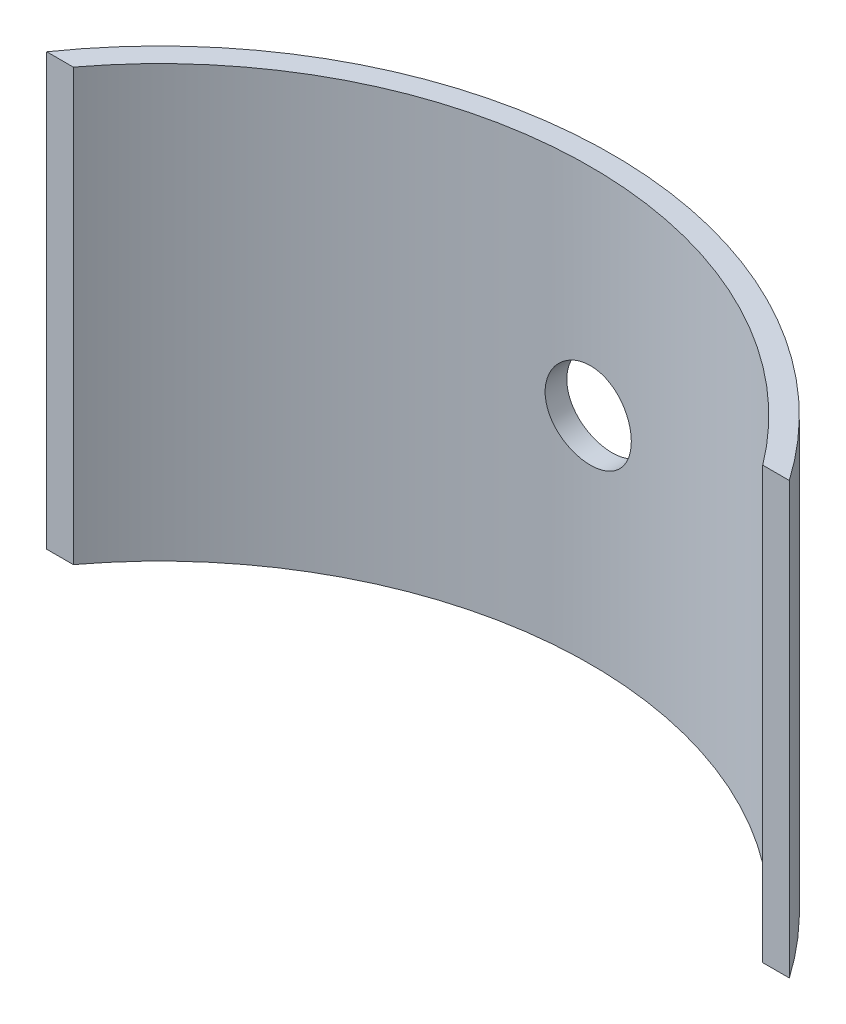
ISO-10303-21;
HEADER;
FILE_DESCRIPTION(('STEP AP214'),'2;1');
FILE_NAME('part.step','',(''),(''),'','','');
FILE_SCHEMA(('AUTOMOTIVE_DESIGN { 1 0 10303 214 1 1 1 1 }'));
ENDSEC;
DATA;
#1=APPLICATION_CONTEXT('core data for automotive mechanical design processes');
#2=APPLICATION_PROTOCOL_DEFINITION('international standard','automotive_design',2000,#1);
#3=PRODUCT_CONTEXT('',#1,'mechanical');
#4=PRODUCT('Part','Part','',(#3));
#5=PRODUCT_RELATED_PRODUCT_CATEGORY('part','',(#4));
#6=PRODUCT_DEFINITION_FORMATION('','',#4);
#7=PRODUCT_DEFINITION_CONTEXT('part definition',#1,'design');
#8=PRODUCT_DEFINITION('design','',#6,#7);
#9=PRODUCT_DEFINITION_SHAPE('','',#8);
#10=(LENGTH_UNIT() NAMED_UNIT(*) SI_UNIT(.MILLI.,.METRE.));
#11=(NAMED_UNIT(*) PLANE_ANGLE_UNIT() SI_UNIT($,.RADIAN.));
#12=(NAMED_UNIT(*) SI_UNIT($,.STERADIAN.) SOLID_ANGLE_UNIT());
#13=UNCERTAINTY_MEASURE_WITH_UNIT(LENGTH_MEASURE(1.E-05),#10,'distance_accuracy_value','');
#14=(GEOMETRIC_REPRESENTATION_CONTEXT(3) GLOBAL_UNCERTAINTY_ASSIGNED_CONTEXT((#13)) GLOBAL_UNIT_ASSIGNED_CONTEXT((#10,
#11,#12)) REPRESENTATION_CONTEXT('',''));
#15=CARTESIAN_POINT('',(0.,0.,0.));
#16=DIRECTION('',(0.,0.,1.));
#17=DIRECTION('',(1.,0.,0.));
#18=AXIS2_PLACEMENT_3D('',#15,#16,#17);
#19=CARTESIAN_POINT('',(0.,25.,0.));
#20=DIRECTION('',(0.,-1.,0.));
#21=DIRECTION('',(0.,0.,-1.));
#22=AXIS2_PLACEMENT_3D('',#19,#20,#21);
#23=CYLINDRICAL_SURFACE('',#22,52.5);
#24=CARTESIAN_POINT('',(0.,-5.,-52.5));
#25=CARTESIAN_POINT('',(0.14013531364392,-5.00000134151966,-52.5000003479525));
#26=CARTESIAN_POINT('',(0.280250015853205,-4.99410638656914,-52.4994377790158));
#27=CARTESIAN_POINT('',(0.559525517952074,-4.97057007837217,-52.4972039627474));
#28=CARTESIAN_POINT('',(0.698686078759655,-4.95292588247516,-52.4955324471138));
#29=CARTESIAN_POINT('',(0.9751257170425,-4.90599667980016,-52.4911255343365));
#30=CARTESIAN_POINT('',(1.11240318560683,-4.87670229078819,-52.4883892797665));
#31=CARTESIAN_POINT('',(1.38403908304545,-4.80667397998405,-52.4819292679164));
#32=CARTESIAN_POINT('',(1.51839642436785,-4.76593587224384,-52.4782051493177));
#33=CARTESIAN_POINT('',(1.78305864402921,-4.67336465527754,-52.4698791325933));
#34=CARTESIAN_POINT('',(1.91336730385473,-4.62154227881319,-52.4652780840543));
#35=CARTESIAN_POINT('',(2.1691966908205,-4.50713074808496,-52.4553236642844));
#36=CARTESIAN_POINT('',(2.29471563422844,-4.44453762960092,-52.4499700161892));
#37=CARTESIAN_POINT('',(2.53996215115011,-4.30908394766377,-52.4386656442903));
#38=CARTESIAN_POINT('',(2.6596930222629,-4.23622932527749,-52.4327152665432));
#39=CARTESIAN_POINT('',(2.89264660361316,-4.08071270179384,-52.4203797029591));
#40=CARTESIAN_POINT('',(3.00586688716291,-3.99804707857352,-52.4139943569091));
#41=CARTESIAN_POINT('',(3.22523963224673,-3.82328987048598,-52.4009535829521));
#42=CARTESIAN_POINT('',(3.33137336210372,-3.73117481932242,-52.3942975087111));
#43=CARTESIAN_POINT('',(3.53554907907228,-3.53830770625079,-52.3809160496089));
#44=CARTESIAN_POINT('',(3.63358806096828,-3.43755246467724,-52.3741906400398));
#45=CARTESIAN_POINT('',(3.82081058979451,-3.22817635951285,-52.3608652908138));
#46=CARTESIAN_POINT('',(3.90999698442136,-3.11955804488229,-52.3542653113647));
#47=CARTESIAN_POINT('',(4.07895213282873,-2.89514826589471,-52.3413730505385));
#48=CARTESIAN_POINT('',(4.15871739914528,-2.77935416927736,-52.3350808836077));
#49=CARTESIAN_POINT('',(4.30834224147955,-2.54125679996572,-52.3229761452991));
#50=CARTESIAN_POINT('',(4.37818622115252,-2.41894368542182,-52.3171643349131));
#51=CARTESIAN_POINT('',(4.5073440806059,-2.16879554668699,-52.3061951564515));
#52=CARTESIAN_POINT('',(4.56665405158915,-2.04095849454375,-52.301038031508));
#53=CARTESIAN_POINT('',(4.6742630971734,-1.78074927309192,-52.2915307788065));
#54=CARTESIAN_POINT('',(4.72256642893059,-1.64837888005766,-52.2871803391599));
#55=CARTESIAN_POINT('',(4.80785448461475,-1.37999976807615,-52.2794064713136));
#56=CARTESIAN_POINT('',(4.84483503943895,-1.24398972898887,-52.2759833846233));
#57=CARTESIAN_POINT('',(4.9381067857902,-0.832886001745291,-52.2672863255648));
#58=CARTESIAN_POINT('',(4.97717685129579,-0.553630164649157,-52.2635435356118));
#59=CARTESIAN_POINT('',(5.00789071078609,0.00734656142198955,-52.2606088213119));
#60=CARTESIAN_POINT('',(4.99953564269351,0.289067391089816,-52.2614167877736));
#61=CARTESIAN_POINT('',(4.93581526450042,0.846187430781424,-52.2674730104633));
#62=CARTESIAN_POINT('',(4.88060446093488,1.12160436604719,-52.2727066727795));
#63=CARTESIAN_POINT('',(4.7249636075338,1.65923401158937,-52.2870038384773));
#64=CARTESIAN_POINT('',(4.62453299807275,1.92144655840793,-52.2960673892562));
#65=CARTESIAN_POINT('',(4.38113647263762,2.42572695741525,-52.3170193503286));
#66=CARTESIAN_POINT('',(4.23810175545865,2.66776140866777,-52.3289123235442));
#67=CARTESIAN_POINT('',(3.9136055470322,3.1244461199737,-52.354179282115));
#68=CARTESIAN_POINT('',(3.73214303632053,3.33909565328103,-52.367553306757));
#69=CARTESIAN_POINT('',(3.33507831222411,3.73581661737379,-52.3943404442024));
#70=CARTESIAN_POINT('',(3.11934258447055,3.9177544493259,-52.4077534996668));
#71=CARTESIAN_POINT('',(2.66031956348734,4.24285248003091,-52.4330568057246));
#72=CARTESIAN_POINT('',(2.41703224355478,4.38601264120018,-52.4449470548419));
#73=CARTESIAN_POINT('',(1.90972127088827,4.62948534982558,-52.4658684219416));
#74=CARTESIAN_POINT('',(1.64569447167729,4.72979138077287,-52.4748991050369));
#75=CARTESIAN_POINT('',(1.10444177653763,4.88461190890257,-52.4890792429146));
#76=CARTESIAN_POINT('',(0.827216238752712,4.93912764784319,-52.4942288029462));
#77=CARTESIAN_POINT('',(0.268592776480475,5.00065121265989,-52.5000529647542));
#78=CARTESIAN_POINT('',(-0.0127846644801465,5.00784345021047,-52.5007449367751));
#79=CARTESIAN_POINT('',(-0.572741040981183,4.97499981452538,-52.4976224774304));
#80=CARTESIAN_POINT('',(-0.851320010715914,4.93496451906915,-52.4938081011953));
#81=CARTESIAN_POINT('',(-1.39724130794261,4.808955239329,-52.4821128144276));
#82=CARTESIAN_POINT('',(-1.66460368187336,4.72306733692417,-52.4742395248873));
#83=CARTESIAN_POINT('',(-2.18112481213043,4.50787911241517,-52.4553100422859));
#84=CARTESIAN_POINT('',(-2.43028319634185,4.37857790318469,-52.4442537841834));
#85=CARTESIAN_POINT('',(-2.90415912523536,4.07977452802365,-52.4201525992081));
#86=CARTESIAN_POINT('',(-3.12879976992931,3.91015089487017,-52.4071017069614));
#87=CARTESIAN_POINT('',(-3.54648563178072,3.53569122041702,-52.3804956739064));
#88=CARTESIAN_POINT('',(-3.73953013048537,3.33085437863461,-52.3669405216404));
#89=CARTESIAN_POINT('',(-4.08918221177076,2.89098328521619,-52.340801617961));
#90=CARTESIAN_POINT('',(-4.2456689739933,2.65585277888327,-52.3282211769348));
#91=CARTESIAN_POINT('',(-4.51693214259576,2.16253094100544,-52.30550580323));
#92=CARTESIAN_POINT('',(-4.63170907319939,1.90433989934419,-52.2953708398164));
#93=CARTESIAN_POINT('',(-4.81609648020373,1.37269691350508,-52.2787128047932));
#94=CARTESIAN_POINT('',(-4.88577946751716,1.09927024112515,-52.2721839370829));
#95=CARTESIAN_POINT('',(-4.97821657531641,0.544378770464139,-52.2634634862119));
#96=CARTESIAN_POINT('',(-5.00097190568196,0.262914179604803,-52.261271791231));
#97=CARTESIAN_POINT('',(-4.99946598191723,-0.158304427790736,-52.2614123077629));
#98=CARTESIAN_POINT('',(-4.99305961731889,-0.298342612050309,-52.2620270839425));
#99=CARTESIAN_POINT('',(-4.96852341889422,-0.577364781272955,-52.2643660586078));
#100=CARTESIAN_POINT('',(-4.95039793441578,-0.716349137992729,-52.2660898455021));
#101=CARTESIAN_POINT('',(-4.90254151538749,-0.992329945151045,-52.2706002891593));
#102=CARTESIAN_POINT('',(-4.87280632235724,-1.12932564699794,-52.2733873359209));
#103=CARTESIAN_POINT('',(-4.80196251814366,-1.40026876476372,-52.2799428256993));
#104=CARTESIAN_POINT('',(-4.76085806977715,-1.53421727701108,-52.283710909483));
#105=CARTESIAN_POINT('',(-4.667555589175,-1.79820164585725,-52.2921228948647));
#106=CARTESIAN_POINT('',(-4.61535478346784,-1.92823651496991,-52.2967670153903));
#107=CARTESIAN_POINT('',(-4.50026154715785,-2.18339806456152,-52.3067966854548));
#108=CARTESIAN_POINT('',(-4.43737302718751,-2.30852651975942,-52.3121819636677));
#109=CARTESIAN_POINT('',(-4.30131466110047,-2.55309229387386,-52.323544906308));
#110=CARTESIAN_POINT('',(-4.22814120329643,-2.67252759375096,-52.329522778614));
#111=CARTESIAN_POINT('',(-4.07207574145236,-2.90478346737744,-52.3418983384914));
#112=CARTESIAN_POINT('',(-3.98918727617687,-3.01760642739649,-52.3482958728259));
#113=CARTESIAN_POINT('',(-3.81388370932565,-3.23635899791297,-52.3613602401979));
#114=CARTESIAN_POINT('',(-3.72142995418944,-3.34225757391284,-52.3680280939716));
#115=CARTESIAN_POINT('',(-3.52797450910814,-3.54585791075006,-52.3814164627042));
#116=CARTESIAN_POINT('',(-3.42697595407042,-3.64356265176129,-52.3881369575361));
#117=CARTESIAN_POINT('',(-3.2170470172539,-3.83018866626228,-52.4014472517834));
#118=CARTESIAN_POINT('',(-3.10811184174264,-3.91910455357586,-52.4080369691002));
#119=CARTESIAN_POINT('',(-2.88317125238579,-4.087425711689,-52.4208928493927));
#120=CARTESIAN_POINT('',(-2.76716846374236,-4.1668344817164,-52.4271591309275));
#121=CARTESIAN_POINT('',(-2.5285500337771,-4.31581638552525,-52.4392099569788));
#122=CARTESIAN_POINT('',(-2.40591743341341,-4.38536246991038,-52.4449931594294));
#123=CARTESIAN_POINT('',(-2.15524218793395,-4.5138410287561,-52.4558925513791));
#124=CARTESIAN_POINT('',(-2.02720154463307,-4.57277738868188,-52.4610089848703));
#125=CARTESIAN_POINT('',(-1.76668198981205,-4.6795978601282,-52.4704279054001));
#126=CARTESIAN_POINT('',(-1.63420684582006,-4.72749109395152,-52.4747310637202));
#127=CARTESIAN_POINT('',(-1.36570820856032,-4.81192763386902,-52.4824054714525));
#128=CARTESIAN_POINT('',(-1.22968560155433,-4.84847374591834,-52.4857769512305));
#129=CARTESIAN_POINT('',(-0.913277188930383,-4.91930639153568,-52.4923609116961));
#130=CARTESIAN_POINT('',(-0.731961290212959,-4.94953773488836,-52.4952143051487));
#131=CARTESIAN_POINT('',(-0.36708513848967,-4.98988362390107,-52.4990336180064));
#132=CARTESIAN_POINT('',(-0.183524893691906,-4.99999824311056,-52.4999995443122));
#133=CARTESIAN_POINT('',(0.,-5.,-52.5));
#134=B_SPLINE_CURVE_WITH_KNOTS('',3,(#24,#25,#26,#27,#28,#29,#30,#31,#32,#33,#34,#35,#36,#37,
#38,#39,#40,#41,#42,#43,#44,#45,#46,#47,#48,#49,#50,#51,#52,#53,#54,#55,#56,#57,#58,#59,#60,#61,
#62,#63,#64,#65,#66,#67,#68,#69,#70,#71,#72,#73,#74,#75,#76,#77,#78,#79,#80,#81,#82,#83,#84,#85,
#86,#87,#88,#89,#90,#91,#92,#93,#94,#95,#96,#97,#98,#99,#100,#101,#102,#103,#104,#105,#106,#107,
#108,#109,#110,#111,#112,#113,#114,#115,#116,#117,#118,#119,#120,#121,#122,#123,#124,#125,#126,
#127,#128,#129,#130,#131,#132,#133),.UNSPECIFIED.,.T.,.F.,(4,2,2,2,2,2,2,2,2,2,2,2,2,2,2,2,2,2,
2,2,2,2,2,2,2,2,2,2,2,2,2,2,2,2,2,2,2,2,2,2,2,2,2,2,2,2,2,2,2,2,2,2,2,2,4),(0.,
0.420245469612846,0.840592651777047,1.26127903928928,1.68211950866895,2.10255431335186,
2.52314419324204,2.94349155905983,3.36399459849575,3.78556840893203,4.20729803352067,
4.62889155362925,5.0506406511181,5.47304557351793,5.89560690942714,6.31800452826858,
6.74055748949688,7.58217388853624,8.42377009384502,9.26260187505151,10.1014440376508,
10.9416482561546,11.7818747675192,12.6254585596195,13.4690431693253,14.3127560110504,
15.1564459719173,15.996846258746,16.8372362642632,17.6760540743434,18.5148890262332,
19.3562836406546,20.1976973845724,21.0418537893482,21.8859995841051,22.7287845999848,
23.5715478870734,23.9916971125211,24.4116904963149,24.831838080053,25.2518320312639,
25.6719310812705,26.0918767467726,26.5119702517189,26.9319112072531,27.3536208536304,
27.7751764490145,28.1969888099996,28.6186454366003,29.0414370148939,29.4640734431906,
29.8863594868938,30.308541022937,30.8589075587697,31.4092720823841),.UNSPECIFIED.);
#135=CARTESIAN_POINT('',(0.,-5.,-52.5));
#136=VERTEX_POINT('',#135);
#137=EDGE_CURVE('E123',#136,#136,#134,.T.);
#138=ORIENTED_EDGE('',*,*,#137,.T.);
#139=EDGE_LOOP('',(#138));
#140=FACE_BOUND('',#139,.T.);
#141=CARTESIAN_POINT('',(0.,-25.,0.));
#142=DIRECTION('',(0.,1.,0.));
#143=DIRECTION('',(0.,0.,1.));
#144=AXIS2_PLACEMENT_3D('',#141,#142,#143);
#145=CIRCLE('',#144,52.5);
#146=CARTESIAN_POINT('',(43.0842198490352,-25.,-30.));
#147=VERTEX_POINT('',#146);
#148=CARTESIAN_POINT('',(-43.0842198490352,-25.,-30.));
#149=VERTEX_POINT('',#148);
#150=EDGE_CURVE('E119',#147,#149,#145,.T.);
#151=ORIENTED_EDGE('',*,*,#150,.T.);
#152=DIRECTION('',(0.,-1.,0.));
#153=VECTOR('',#152,1.);
#154=CARTESIAN_POINT('',(-43.0842198490352,25.,-30.));
#155=LINE('',#154,#153);
#156=CARTESIAN_POINT('',(-43.0842198490352,25.,-30.));
#157=VERTEX_POINT('',#156);
#158=EDGE_CURVE('E11',#157,#149,#155,.T.);
#159=ORIENTED_EDGE('',*,*,#158,.F.);
#160=CARTESIAN_POINT('',(0.,25.,0.));
#161=DIRECTION('',(0.,1.,0.));
#162=DIRECTION('',(0.,0.,1.));
#163=AXIS2_PLACEMENT_3D('',#160,#161,#162);
#164=CIRCLE('',#163,52.5);
#165=CARTESIAN_POINT('',(43.0842198490352,25.,-30.));
#166=VERTEX_POINT('',#165);
#167=EDGE_CURVE('E102',#166,#157,#164,.T.);
#168=ORIENTED_EDGE('',*,*,#167,.F.);
#169=DIRECTION('',(0.,-1.,0.));
#170=VECTOR('',#169,1.);
#171=CARTESIAN_POINT('',(43.0842198490352,25.,-30.));
#172=LINE('',#171,#170);
#173=EDGE_CURVE('E115',#166,#147,#172,.T.);
#174=ORIENTED_EDGE('',*,*,#173,.T.);
#175=EDGE_LOOP('',(#151,#159,#168,#174));
#176=FACE_BOUND('',#175,.T.);
#177=ADVANCED_FACE('F43',(#140,#176),#23,.T.);
#178=CARTESIAN_POINT('',(-43.0842198490352,25.,-30.));
#179=DIRECTION('',(0.,0.,-1.));
#180=DIRECTION('',(-1.,0.,0.));
#181=AXIS2_PLACEMENT_3D('',#178,#179,#180);
#182=PLANE('',#181);
#183=DIRECTION('',(1.,0.,0.));
#184=VECTOR('',#183,1.);
#185=CARTESIAN_POINT('',(-43.0842198490352,-25.,-30.));
#186=LINE('',#185,#184);
#187=CARTESIAN_POINT('',(-40.,-25.,-30.));
#188=VERTEX_POINT('',#187);
#189=EDGE_CURVE('E107',#149,#188,#186,.T.);
#190=ORIENTED_EDGE('',*,*,#189,.T.);
#191=DIRECTION('',(0.,-1.,0.));
#192=VECTOR('',#191,1.);
#193=CARTESIAN_POINT('',(-40.,25.,-30.));
#194=LINE('',#193,#192);
#195=CARTESIAN_POINT('',(-40.,25.,-30.));
#196=VERTEX_POINT('',#195);
#197=EDGE_CURVE('E59',#196,#188,#194,.T.);
#198=ORIENTED_EDGE('',*,*,#197,.F.);
#199=DIRECTION('',(1.,0.,0.));
#200=VECTOR('',#199,1.);
#201=CARTESIAN_POINT('',(-43.0842198490352,25.,-30.));
#202=LINE('',#201,#200);
#203=EDGE_CURVE('E97',#157,#196,#202,.T.);
#204=ORIENTED_EDGE('',*,*,#203,.F.);
#205=ORIENTED_EDGE('',*,*,#158,.T.);
#206=EDGE_LOOP('',(#190,#198,#204,#205));
#207=FACE_BOUND('',#206,.T.);
#208=ADVANCED_FACE('F106',(#207),#182,.F.);
#209=CARTESIAN_POINT('',(0.,25.,0.));
#210=DIRECTION('',(0.,-1.,0.));
#211=DIRECTION('',(0.,0.,-1.));
#212=AXIS2_PLACEMENT_3D('',#209,#210,#211);
#213=CYLINDRICAL_SURFACE('',#212,50.);
#214=CARTESIAN_POINT('',(5.,0.,-49.749371855331));
#215=CARTESIAN_POINT('',(5.00000137801268,-0.140098491041389,-49.7493714739879));
#216=CARTESIAN_POINT('',(4.99410950132877,-0.280175952551297,-49.7499648645192));
#217=CARTESIAN_POINT('',(4.97058574667104,-0.559376673886156,-49.7523207806819));
#218=CARTESIAN_POINT('',(4.95295105278473,-0.69849969675159,-49.7540835867374));
#219=CARTESIAN_POINT('',(4.90604778501381,-0.974862766304594,-49.758730371628));
#220=CARTESIAN_POINT('',(4.87676993272644,-1.11210122073172,-49.7616152445949));
#221=CARTESIAN_POINT('',(4.80678208564671,-1.38365924644498,-49.7684245439498));
#222=CARTESIAN_POINT('',(4.76606790661486,-1.51797772997825,-49.7723493507912));
#223=CARTESIAN_POINT('',(4.67355297319563,-1.78256126592085,-49.7811214960436));
#224=CARTESIAN_POINT('',(4.62176310368343,-1.9128301552197,-49.7859679281928));
#225=CARTESIAN_POINT('',(4.50742487178653,-2.16858221198546,-49.7964498317184));
#226=CARTESIAN_POINT('',(4.44487254796571,-2.29406359641917,-49.802085593488));
#227=CARTESIAN_POINT('',(4.30950824036611,-2.53923931351373,-49.8139814691518));
#228=CARTESIAN_POINT('',(4.23670214819133,-2.6589369167397,-49.820241223913));
#229=CARTESIAN_POINT('',(4.08129001384987,-2.89182937224855,-49.833213339352));
#230=CARTESIAN_POINT('',(3.99868035100199,-3.00502179897072,-49.8399258668515));
#231=CARTESIAN_POINT('',(3.82401365076816,-3.22438095854661,-49.8536318919189));
#232=CARTESIAN_POINT('',(3.73193021365888,-3.33052662420811,-49.8606261396673));
#233=CARTESIAN_POINT('',(3.53912598644838,-3.53472950631079,-49.8746822607949));
#234=CARTESIAN_POINT('',(3.43840201622495,-3.63278371844144,-49.8817441582155));
#235=CARTESIAN_POINT('',(3.22908697054911,-3.82004061957829,-49.8957312091272));
#236=CARTESIAN_POINT('',(3.12049844179171,-3.90924615198054,-49.9026564059684));
#237=CARTESIAN_POINT('',(2.89614565742538,-4.07824367813921,-49.9161794607368));
#238=CARTESIAN_POINT('',(2.780378768861,-4.15803218629013,-49.9227771969379));
#239=CARTESIAN_POINT('',(2.54231086820845,-4.3077208860877,-49.9354672050881));
#240=CARTESIAN_POINT('',(2.41999887482734,-4.37760369280579,-49.9415585807929));
#241=CARTESIAN_POINT('',(2.16984658788752,-4.5068388127033,-49.95305247823));
#242=CARTESIAN_POINT('',(2.04200426340686,-4.56618721576076,-49.9584547439725));
#243=CARTESIAN_POINT('',(1.78177823539071,-4.67387162677189,-49.9684119508101));
#244=CARTESIAN_POINT('',(1.64939631724147,-4.72221190825414,-49.9729672205962));
#245=CARTESIAN_POINT('',(1.38098814479936,-4.80757140712378,-49.9811060833905));
#246=CARTESIAN_POINT('',(1.2449605686204,-4.84458645598165,-49.9846893185627));
#247=CARTESIAN_POINT('',(0.833882388769762,-4.93793664179355,-49.9937912974821));
#248=CARTESIAN_POINT('',(0.554665092858853,-4.97705998976185,-49.9977085084183));
#249=CARTESIAN_POINT('',(-0.00624616004479898,-5.00789051928896,-50.0007876636083));
#250=CARTESIAN_POINT('',(-0.287940052633876,-4.99959893024861,-49.9999497311561));
#251=CARTESIAN_POINT('',(-0.844932903547254,-4.93602385878112,-49.9936330634674));
#252=CARTESIAN_POINT('',(-1.12025111715595,-4.88090840981091,-49.9881709230417));
#253=CARTESIAN_POINT('',(-1.657698930081,-4.72549536764968,-49.9732365977921));
#254=CARTESIAN_POINT('',(-1.91982835803123,-4.62519718755336,-49.9637643608788));
#255=CARTESIAN_POINT('',(-2.42400075872671,-4.38208591175966,-49.9418468380512));
#256=CARTESIAN_POINT('',(-2.66600763658342,-4.23919843946393,-49.9293963586015));
#257=CARTESIAN_POINT('',(-3.1226677842022,-3.91501745620558,-49.9029192356571));
#258=CARTESIAN_POINT('',(-3.33732025142287,-3.73372281884395,-49.8888925459413));
#259=CARTESIAN_POINT('',(-3.73416380023819,-3.33692883277627,-49.8607646707804));
#260=CARTESIAN_POINT('',(-3.91620871518172,-3.12128327102483,-49.8466634279516));
#261=CARTESIAN_POINT('',(-4.24153769255961,-2.66241567921341,-49.8200369971109));
#262=CARTESIAN_POINT('',(-4.38482169876916,-2.41919360915293,-49.8075118113852));
#263=CARTESIAN_POINT('',(-4.62856091866056,-1.91196487258711,-49.7854544755204));
#264=CARTESIAN_POINT('',(-4.72900710181732,-1.64795383749873,-49.7759229565795));
#265=CARTESIAN_POINT('',(-4.88410367923539,-1.10669697731338,-49.7609450935951));
#266=CARTESIAN_POINT('',(-4.93875546869956,-0.829451555696176,-49.7554986250941));
#267=CARTESIAN_POINT('',(-5.00052387697534,-0.270879102219641,-49.7493290263652));
#268=CARTESIAN_POINT('',(-5.00784498433649,0.01042510147082,-49.7485855774055));
#269=CARTESIAN_POINT('',(-4.97528123325639,0.570256328967664,-49.7518525677133));
#270=CARTESIAN_POINT('',(-4.93539701266267,0.848783390248052,-49.7558629427463));
#271=CARTESIAN_POINT('',(-4.80972587691448,1.39455791184454,-49.7681672212266));
#272=CARTESIAN_POINT('',(-4.72403565233786,1.66182785713668,-49.7764521004679));
#273=CARTESIAN_POINT('',(-4.50928358198601,2.1782002569881,-49.7963645515391));
#274=CARTESIAN_POINT('',(-4.3802207427195,2.427302295235,-49.8079921999376));
#275=CARTESIAN_POINT('',(-4.08187506852299,2.90119987636591,-49.8333292192867));
#276=CARTESIAN_POINT('',(-3.91245672874386,3.12590973308702,-49.8470455463444));
#277=CARTESIAN_POINT('',(-3.53840243770979,3.543775243114,-49.8749916256484));
#278=CARTESIAN_POINT('',(-3.33376561445491,3.73693011489627,-49.8892213906003));
#279=CARTESIAN_POINT('',(-2.89419988100485,4.0869082541073,-49.9166524134836));
#280=CARTESIAN_POINT('',(-2.65916449432984,4.24359812360197,-49.9298497813476));
#281=CARTESIAN_POINT('',(-2.16598537264713,4.51527901686565,-49.9536720267587));
#282=CARTESIAN_POINT('',(-1.90784195433101,4.63027061199326,-49.9642969395534));
#283=CARTESIAN_POINT('',(-1.37629260849047,4.81507005164163,-49.9817608134462));
#284=CARTESIAN_POINT('',(-1.10291484771759,4.88495846123832,-49.9886065219256));
#285=CARTESIAN_POINT('',(-0.54807941170579,4.97781082341413,-49.99776363907));
#286=CARTESIAN_POINT('',(-0.266621963774155,5.00077609478093,-50.0000751751691));
#287=CARTESIAN_POINT('',(0.154560631877543,4.99958183613786,-49.9999593967711));
#288=CARTESIAN_POINT('',(0.294557002326111,4.99328306170478,-49.9993276094659));
#289=CARTESIAN_POINT('',(0.573504458936777,4.96896915983657,-49.9969046663024));
#290=CARTESIAN_POINT('',(0.712455913740134,4.95095838140531,-49.9951139407924));
#291=CARTESIAN_POINT('',(0.988379892074267,4.90333802028199,-49.9904208009026));
#292=CARTESIAN_POINT('',(1.1253516718031,4.8737241898305,-49.9875179794045));
#293=CARTESIAN_POINT('',(1.39625643078088,4.80312925445173,-49.9806844280751));
#294=CARTESIAN_POINT('',(1.53019050208044,4.76215230692938,-49.9767540742154));
#295=CARTESIAN_POINT('',(1.79415256649365,4.66911182699942,-49.967974366883));
#296=CARTESIAN_POINT('',(1.92417967668243,4.61704580978383,-49.963124807464));
#297=CARTESIAN_POINT('',(2.17933687671623,4.50222783995048,-49.952645478799));
#298=CARTESIAN_POINT('',(2.30446873549389,4.43947979205207,-49.9470159947868));
#299=CARTESIAN_POINT('',(2.5490538144201,4.30370720469097,-49.9351311532279));
#300=CARTESIAN_POINT('',(2.66850500847289,4.23067903490019,-49.9288755748083));
#301=CARTESIAN_POINT('',(2.90080624471961,4.07490776962624,-49.9159178406001));
#302=CARTESIAN_POINT('',(3.01365866446037,3.99216820588869,-49.9092158475405));
#303=CARTESIAN_POINT('',(3.23252356376648,3.81713445038904,-49.89551955036));
#304=CARTESIAN_POINT('',(3.33850247977287,3.72479837998216,-49.8885240518713));
#305=CARTESIAN_POINT('',(3.54227369236162,3.53157256364417,-49.8744696846306));
#306=CARTESIAN_POINT('',(3.64006896222842,3.43068595134852,-49.8674108399346));
#307=CARTESIAN_POINT('',(3.82688647618723,3.22097372784746,-49.8534223720552));
#308=CARTESIAN_POINT('',(3.91590334417577,3.11214332179257,-49.84649283014));
#309=CARTESIAN_POINT('',(4.0844367545897,2.88740318662561,-49.8329662289084));
#310=CARTESIAN_POINT('',(4.16395679237156,2.7714960860114,-49.826369047785));
#311=CARTESIAN_POINT('',(4.31318841414872,2.53303116088225,-49.8136731501774));
#312=CARTESIAN_POINT('',(4.38287067354808,2.41045490109803,-49.807575945768));
#313=CARTESIAN_POINT('',(4.51162543706042,2.15987757482205,-49.7960782991411));
#314=CARTESIAN_POINT('',(4.57070182657144,2.03187851626804,-49.7906776019673));
#315=CARTESIAN_POINT('',(4.67780484539498,1.77142588335074,-49.7807295606041));
#316=CARTESIAN_POINT('',(4.72584052841938,1.63897606165492,-49.7761815177806));
#317=CARTESIAN_POINT('',(4.81056224313698,1.37051262860164,-49.7680650371174));
#318=CARTESIAN_POINT('',(4.84725106324241,1.23449990172907,-49.7644963586299));
#319=CARTESIAN_POINT('',(4.91858203515326,0.917334200325168,-49.7575042744209));
#320=CARTESIAN_POINT('',(4.94908441090261,0.735226245254887,-49.7544669050514));
#321=CARTESIAN_POINT('',(4.98979244409666,0.36873338315763,-49.7504009506177));
#322=CARTESIAN_POINT('',(4.99999818674314,0.184348485692138,-49.749372357121));
#323=CARTESIAN_POINT('',(5.,0.,-49.749371855331));
#324=B_SPLINE_CURVE_WITH_KNOTS('',3,(#214,#215,#216,#217,#218,#219,#220,#221,#222,#223,#224,
#225,#226,#227,#228,#229,#230,#231,#232,#233,#234,#235,#236,#237,#238,#239,#240,#241,#242,#243,
#244,#245,#246,#247,#248,#249,#250,#251,#252,#253,#254,#255,#256,#257,#258,#259,#260,#261,#262,
#263,#264,#265,#266,#267,#268,#269,#270,#271,#272,#273,#274,#275,#276,#277,#278,#279,#280,#281,
#282,#283,#284,#285,#286,#287,#288,#289,#290,#291,#292,#293,#294,#295,#296,#297,#298,#299,#300,
#301,#302,#303,#304,#305,#306,#307,#308,#309,#310,#311,#312,#313,#314,#315,#316,#317,#318,#319,
#320,#321,#322,#323),.UNSPECIFIED.,.T.,.F.,(4,2,2,2,2,2,2,2,2,2,2,2,2,2,2,2,2,2,2,2,2,2,2,2,2,2,
2,2,2,2,2,2,2,2,2,2,2,2,2,2,2,2,2,2,2,2,2,2,2,2,2,2,2,2,4),(0.,0.420134252377987,
0.840369288708553,1.26093988247998,1.68166455241807,2.10197763072134,2.52244574981762,
2.9426732548295,3.36305644524304,3.78464455225725,4.20638849474177,4.62799647384532,
5.04976002021869,5.47225484994391,5.8949061733306,6.31739313593607,6.74003541866831,
7.58156484320105,8.42307244819019,9.26157288921165,10.1000842223273,10.9400685715992,
11.780077559205,12.6237625525286,13.4674487696567,14.3113127541752,15.1551510280302,
15.9953411136668,16.8355198466221,17.6739320335049,18.5123634263309,19.3536507888645,
20.1949589844387,21.0392981391845,21.8836257241788,22.7264409329966,23.569232453936,
23.9892420866313,24.4090958466629,24.8291034547195,25.2489575975693,25.6689059193386,
26.0887010611433,26.5086448232865,26.9284363348062,27.3501435264971,27.7716968321211,
28.1935067243476,28.6151608857008,29.0380465190118,29.4607769131124,29.8831594088447,
30.3054380244043,30.8582736600065,31.411106974895),.UNSPECIFIED.);
#325=CARTESIAN_POINT('',(5.,0.,-49.749371855331));
#326=VERTEX_POINT('',#325);
#327=EDGE_CURVE('E47',#326,#326,#324,.T.);
#328=ORIENTED_EDGE('',*,*,#327,.T.);
#329=EDGE_LOOP('',(#328));
#330=FACE_BOUND('',#329,.T.);
#331=CARTESIAN_POINT('',(0.,-25.,0.));
#332=DIRECTION('',(0.,-1.,0.));
#333=DIRECTION('',(0.,0.,1.));
#334=AXIS2_PLACEMENT_3D('',#331,#332,#333);
#335=CIRCLE('',#334,50.);
#336=CARTESIAN_POINT('',(40.,-25.,-30.));
#337=VERTEX_POINT('',#336);
#338=EDGE_CURVE('E84',#188,#337,#335,.T.);
#339=ORIENTED_EDGE('',*,*,#338,.T.);
#340=DIRECTION('',(0.,-1.,0.));
#341=VECTOR('',#340,1.);
#342=CARTESIAN_POINT('',(40.,25.,-30.));
#343=LINE('',#342,#341);
#344=CARTESIAN_POINT('',(40.,25.,-30.));
#345=VERTEX_POINT('',#344);
#346=EDGE_CURVE('E109',#345,#337,#343,.T.);
#347=ORIENTED_EDGE('',*,*,#346,.F.);
#348=CARTESIAN_POINT('',(0.,25.,0.));
#349=DIRECTION('',(0.,-1.,0.));
#350=DIRECTION('',(0.,0.,1.));
#351=AXIS2_PLACEMENT_3D('',#348,#349,#350);
#352=CIRCLE('',#351,50.);
#353=EDGE_CURVE('E100',#196,#345,#352,.T.);
#354=ORIENTED_EDGE('',*,*,#353,.F.);
#355=ORIENTED_EDGE('',*,*,#197,.T.);
#356=EDGE_LOOP('',(#339,#347,#354,#355));
#357=FACE_BOUND('',#356,.T.);
#358=ADVANCED_FACE('F111',(#330,#357),#213,.F.);
#359=CARTESIAN_POINT('',(40.,25.,-30.));
#360=DIRECTION('',(0.,0.,-1.));
#361=DIRECTION('',(-1.,0.,0.));
#362=AXIS2_PLACEMENT_3D('',#359,#360,#361);
#363=PLANE('',#362);
#364=DIRECTION('',(1.,0.,0.));
#365=VECTOR('',#364,1.);
#366=CARTESIAN_POINT('',(40.,-25.,-30.));
#367=LINE('',#366,#365);
#368=EDGE_CURVE('E90',#337,#147,#367,.T.);
#369=ORIENTED_EDGE('',*,*,#368,.T.);
#370=ORIENTED_EDGE('',*,*,#173,.F.);
#371=DIRECTION('',(1.,0.,0.));
#372=VECTOR('',#371,1.);
#373=CARTESIAN_POINT('',(40.,25.,-30.));
#374=LINE('',#373,#372);
#375=EDGE_CURVE('E67',#345,#166,#374,.T.);
#376=ORIENTED_EDGE('',*,*,#375,.F.);
#377=ORIENTED_EDGE('',*,*,#346,.T.);
#378=EDGE_LOOP('',(#369,#370,#376,#377));
#379=FACE_BOUND('',#378,.T.);
#380=ADVANCED_FACE('F133',(#379),#363,.F.);
#381=CARTESIAN_POINT('',(0.,25.,0.));
#382=DIRECTION('',(0.,1.,0.));
#383=DIRECTION('',(0.,0.,1.));
#384=AXIS2_PLACEMENT_3D('',#381,#382,#383);
#385=PLANE('',#384);
#386=ORIENTED_EDGE('',*,*,#167,.T.);
#387=ORIENTED_EDGE('',*,*,#203,.T.);
#388=ORIENTED_EDGE('',*,*,#353,.T.);
#389=ORIENTED_EDGE('',*,*,#375,.T.);
#390=EDGE_LOOP('',(#386,#387,#388,#389));
#391=FACE_BOUND('',#390,.T.);
#392=ADVANCED_FACE('F98',(#391),#385,.T.);
#393=CARTESIAN_POINT('',(0.,-25.,0.));
#394=DIRECTION('',(0.,1.,0.));
#395=DIRECTION('',(0.,0.,1.));
#396=AXIS2_PLACEMENT_3D('',#393,#394,#395);
#397=PLANE('',#396);
#398=ORIENTED_EDGE('',*,*,#150,.F.);
#399=ORIENTED_EDGE('',*,*,#368,.F.);
#400=ORIENTED_EDGE('',*,*,#338,.F.);
#401=ORIENTED_EDGE('',*,*,#189,.F.);
#402=EDGE_LOOP('',(#398,#399,#400,#401));
#403=FACE_BOUND('',#402,.T.);
#404=ADVANCED_FACE('F136',(#403),#397,.F.);
#405=CARTESIAN_POINT('',(0.,0.,-52.5));
#406=DIRECTION('',(0.,0.,1.));
#407=DIRECTION('',(1.,0.,0.));
#408=AXIS2_PLACEMENT_3D('',#405,#406,#407);
#409=CYLINDRICAL_SURFACE('',#408,5.);
#410=ORIENTED_EDGE('',*,*,#327,.F.);
#411=EDGE_LOOP('',(#410));
#412=FACE_BOUND('',#411,.T.);
#413=ORIENTED_EDGE('',*,*,#137,.F.);
#414=EDGE_LOOP('',(#413));
#415=FACE_BOUND('',#414,.T.);
#416=ADVANCED_FACE('F145',(#412,#415),#409,.F.);
#417=CLOSED_SHELL('',(#177,#208,#358,#380,#392,#404,#416));
#418=MANIFOLD_SOLID_BREP('B2',#417);
#419=ADVANCED_BREP_SHAPE_REPRESENTATION('',(#18,#418),#14);
#420=SHAPE_DEFINITION_REPRESENTATION(#9,#419);
ENDSEC;
END-ISO-10303-21;
